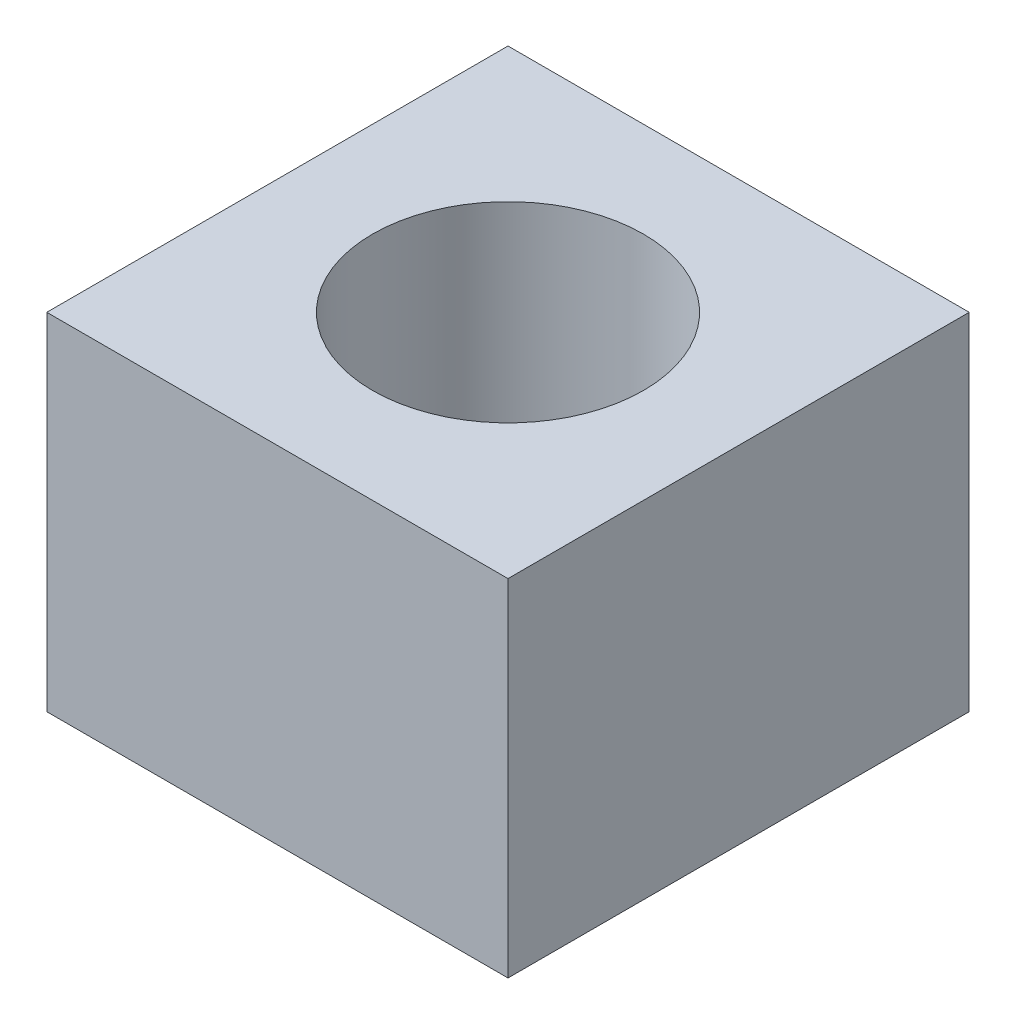
ISO-10303-21;
HEADER;
FILE_DESCRIPTION(('STEP AP214'),'2;1');
FILE_NAME('part.step','',(''),(''),'','','');
FILE_SCHEMA(('AUTOMOTIVE_DESIGN { 1 0 10303 214 1 1 1 1 }'));
ENDSEC;
DATA;
#1=APPLICATION_CONTEXT('core data for automotive mechanical design processes');
#2=APPLICATION_PROTOCOL_DEFINITION('international standard','automotive_design',2000,#1);
#3=PRODUCT_CONTEXT('',#1,'mechanical');
#4=PRODUCT('Part','Part','',(#3));
#5=PRODUCT_RELATED_PRODUCT_CATEGORY('part','',(#4));
#6=PRODUCT_DEFINITION_FORMATION('','',#4);
#7=PRODUCT_DEFINITION_CONTEXT('part definition',#1,'design');
#8=PRODUCT_DEFINITION('design','',#6,#7);
#9=PRODUCT_DEFINITION_SHAPE('','',#8);
#10=(LENGTH_UNIT() NAMED_UNIT(*) SI_UNIT(.MILLI.,.METRE.));
#11=(NAMED_UNIT(*) PLANE_ANGLE_UNIT() SI_UNIT($,.RADIAN.));
#12=(NAMED_UNIT(*) SI_UNIT($,.STERADIAN.) SOLID_ANGLE_UNIT());
#13=UNCERTAINTY_MEASURE_WITH_UNIT(LENGTH_MEASURE(1.E-05),#10,'distance_accuracy_value','');
#14=(GEOMETRIC_REPRESENTATION_CONTEXT(3) GLOBAL_UNCERTAINTY_ASSIGNED_CONTEXT((#13)) GLOBAL_UNIT_ASSIGNED_CONTEXT((#10,
#11,#12)) REPRESENTATION_CONTEXT('',''));
#15=CARTESIAN_POINT('',(0.,0.,0.));
#16=DIRECTION('',(0.,0.,1.));
#17=DIRECTION('',(1.,0.,0.));
#18=AXIS2_PLACEMENT_3D('',#15,#16,#17);
#19=CARTESIAN_POINT('',(40.,60.,40.));
#20=DIRECTION('',(-1.,0.,0.));
#21=DIRECTION('',(0.,0.,1.));
#22=AXIS2_PLACEMENT_3D('',#19,#20,#21);
#23=PLANE('',#22);
#24=DIRECTION('',(0.,0.,-1.));
#25=VECTOR('',#24,1.);
#26=CARTESIAN_POINT('',(40.,0.,40.));
#27=LINE('',#26,#25);
#28=CARTESIAN_POINT('',(40.,0.,40.));
#29=VERTEX_POINT('',#28);
#30=CARTESIAN_POINT('',(40.,0.,-40.));
#31=VERTEX_POINT('',#30);
#32=EDGE_CURVE('E105',#29,#31,#27,.T.);
#33=ORIENTED_EDGE('',*,*,#32,.T.);
#34=DIRECTION('',(0.,-1.,0.));
#35=VECTOR('',#34,1.);
#36=CARTESIAN_POINT('',(40.,60.,-40.));
#37=LINE('',#36,#35);
#38=CARTESIAN_POINT('',(40.,60.,-40.));
#39=VERTEX_POINT('',#38);
#40=EDGE_CURVE('E11',#39,#31,#37,.T.);
#41=ORIENTED_EDGE('',*,*,#40,.F.);
#42=DIRECTION('',(0.,0.,-1.));
#43=VECTOR('',#42,1.);
#44=CARTESIAN_POINT('',(40.,60.,40.));
#45=LINE('',#44,#43);
#46=CARTESIAN_POINT('',(40.,60.,40.));
#47=VERTEX_POINT('',#46);
#48=EDGE_CURVE('E89',#47,#39,#45,.T.);
#49=ORIENTED_EDGE('',*,*,#48,.F.);
#50=DIRECTION('',(0.,-1.,0.));
#51=VECTOR('',#50,1.);
#52=CARTESIAN_POINT('',(40.,60.,40.));
#53=LINE('',#52,#51);
#54=EDGE_CURVE('E97',#47,#29,#53,.T.);
#55=ORIENTED_EDGE('',*,*,#54,.T.);
#56=EDGE_LOOP('',(#33,#41,#49,#55));
#57=FACE_BOUND('',#56,.T.);
#58=ADVANCED_FACE('F39',(#57),#23,.F.);
#59=CARTESIAN_POINT('',(-40.,60.,-40.));
#60=DIRECTION('',(0.,0.,1.));
#61=DIRECTION('',(1.,0.,0.));
#62=AXIS2_PLACEMENT_3D('',#59,#60,#61);
#63=PLANE('',#62);
#64=DIRECTION('',(-1.,0.,0.));
#65=VECTOR('',#64,1.);
#66=CARTESIAN_POINT('',(-40.,0.,-40.));
#67=LINE('',#66,#65);
#68=CARTESIAN_POINT('',(-40.,0.,-40.));
#69=VERTEX_POINT('',#68);
#70=EDGE_CURVE('E92',#31,#69,#67,.T.);
#71=ORIENTED_EDGE('',*,*,#70,.T.);
#72=DIRECTION('',(0.,-1.,0.));
#73=VECTOR('',#72,1.);
#74=CARTESIAN_POINT('',(-40.,60.,-40.));
#75=LINE('',#74,#73);
#76=CARTESIAN_POINT('',(-40.,60.,-40.));
#77=VERTEX_POINT('',#76);
#78=EDGE_CURVE('E50',#77,#69,#75,.T.);
#79=ORIENTED_EDGE('',*,*,#78,.F.);
#80=DIRECTION('',(-1.,0.,0.));
#81=VECTOR('',#80,1.);
#82=CARTESIAN_POINT('',(-40.,60.,-40.));
#83=LINE('',#82,#81);
#84=EDGE_CURVE('E82',#39,#77,#83,.T.);
#85=ORIENTED_EDGE('',*,*,#84,.F.);
#86=ORIENTED_EDGE('',*,*,#40,.T.);
#87=EDGE_LOOP('',(#71,#79,#85,#86));
#88=FACE_BOUND('',#87,.T.);
#89=ADVANCED_FACE('F93',(#88),#63,.F.);
#90=CARTESIAN_POINT('',(-40.,60.,40.));
#91=DIRECTION('',(1.,0.,0.));
#92=DIRECTION('',(0.,0.,-1.));
#93=AXIS2_PLACEMENT_3D('',#90,#91,#92);
#94=PLANE('',#93);
#95=DIRECTION('',(0.,0.,1.));
#96=VECTOR('',#95,1.);
#97=CARTESIAN_POINT('',(-40.,0.,40.));
#98=LINE('',#97,#96);
#99=CARTESIAN_POINT('',(-40.,0.,40.));
#100=VERTEX_POINT('',#99);
#101=EDGE_CURVE('E75',#69,#100,#98,.T.);
#102=ORIENTED_EDGE('',*,*,#101,.T.);
#103=DIRECTION('',(0.,-1.,0.));
#104=VECTOR('',#103,1.);
#105=CARTESIAN_POINT('',(-40.,60.,40.));
#106=LINE('',#105,#104);
#107=CARTESIAN_POINT('',(-40.,60.,40.));
#108=VERTEX_POINT('',#107);
#109=EDGE_CURVE('E94',#108,#100,#106,.T.);
#110=ORIENTED_EDGE('',*,*,#109,.F.);
#111=DIRECTION('',(0.,0.,1.));
#112=VECTOR('',#111,1.);
#113=CARTESIAN_POINT('',(-40.,60.,40.));
#114=LINE('',#113,#112);
#115=EDGE_CURVE('E88',#77,#108,#114,.T.);
#116=ORIENTED_EDGE('',*,*,#115,.F.);
#117=ORIENTED_EDGE('',*,*,#78,.T.);
#118=EDGE_LOOP('',(#102,#110,#116,#117));
#119=FACE_BOUND('',#118,.T.);
#120=ADVANCED_FACE('F96',(#119),#94,.F.);
#121=CARTESIAN_POINT('',(-40.,60.,40.));
#122=DIRECTION('',(0.,0.,-1.));
#123=DIRECTION('',(-1.,0.,0.));
#124=AXIS2_PLACEMENT_3D('',#121,#122,#123);
#125=PLANE('',#124);
#126=DIRECTION('',(1.,0.,0.));
#127=VECTOR('',#126,1.);
#128=CARTESIAN_POINT('',(-40.,0.,40.));
#129=LINE('',#128,#127);
#130=EDGE_CURVE('E76',#100,#29,#129,.T.);
#131=ORIENTED_EDGE('',*,*,#130,.T.);
#132=ORIENTED_EDGE('',*,*,#54,.F.);
#133=DIRECTION('',(1.,0.,0.));
#134=VECTOR('',#133,1.);
#135=CARTESIAN_POINT('',(-40.,60.,40.));
#136=LINE('',#135,#134);
#137=EDGE_CURVE('E54',#108,#47,#136,.T.);
#138=ORIENTED_EDGE('',*,*,#137,.F.);
#139=ORIENTED_EDGE('',*,*,#109,.T.);
#140=EDGE_LOOP('',(#131,#132,#138,#139));
#141=FACE_BOUND('',#140,.T.);
#142=ADVANCED_FACE('F109',(#141),#125,.F.);
#143=CARTESIAN_POINT('',(0.,60.,0.));
#144=DIRECTION('',(0.,-1.,0.));
#145=DIRECTION('',(0.,0.,-1.));
#146=AXIS2_PLACEMENT_3D('',#143,#144,#145);
#147=PLANE('',#146);
#148=CARTESIAN_POINT('',(0.,60.,0.));
#149=DIRECTION('',(0.,1.,0.));
#150=DIRECTION('',(0.,0.,1.));
#151=AXIS2_PLACEMENT_3D('',#148,#149,#150);
#152=CIRCLE('',#151,23.5);
#153=CARTESIAN_POINT('',(0.,60.,23.5));
#154=VERTEX_POINT('',#153);
#155=EDGE_CURVE('E118',#154,#154,#152,.T.);
#156=ORIENTED_EDGE('',*,*,#155,.F.);
#157=EDGE_LOOP('',(#156));
#158=FACE_BOUND('',#157,.T.);
#159=ORIENTED_EDGE('',*,*,#48,.T.);
#160=ORIENTED_EDGE('',*,*,#84,.T.);
#161=ORIENTED_EDGE('',*,*,#115,.T.);
#162=ORIENTED_EDGE('',*,*,#137,.T.);
#163=EDGE_LOOP('',(#159,#160,#161,#162));
#164=FACE_BOUND('',#163,.T.);
#165=ADVANCED_FACE('F86',(#158,#164),#147,.F.);
#166=CARTESIAN_POINT('',(0.,0.,0.));
#167=DIRECTION('',(0.,-1.,0.));
#168=DIRECTION('',(0.,0.,-1.));
#169=AXIS2_PLACEMENT_3D('',#166,#167,#168);
#170=PLANE('',#169);
#171=ORIENTED_EDGE('',*,*,#32,.F.);
#172=ORIENTED_EDGE('',*,*,#130,.F.);
#173=ORIENTED_EDGE('',*,*,#101,.F.);
#174=ORIENTED_EDGE('',*,*,#70,.F.);
#175=EDGE_LOOP('',(#171,#172,#173,#174));
#176=FACE_BOUND('',#175,.T.);
#177=ADVANCED_FACE('F111',(#176),#170,.T.);
#178=CARTESIAN_POINT('',(0.,15.8,0.));
#179=DIRECTION('',(0.,1.,0.));
#180=DIRECTION('',(0.,0.,1.));
#181=AXIS2_PLACEMENT_3D('',#178,#179,#180);
#182=CYLINDRICAL_SURFACE('',#181,23.5);
#183=CARTESIAN_POINT('',(0.,15.8,0.));
#184=DIRECTION('',(0.,1.,0.));
#185=DIRECTION('',(0.,0.,1.));
#186=AXIS2_PLACEMENT_3D('',#183,#184,#185);
#187=CIRCLE('',#186,23.5);
#188=CARTESIAN_POINT('',(0.,15.8,23.5));
#189=VERTEX_POINT('',#188);
#190=EDGE_CURVE('E103',#189,#189,#187,.T.);
#191=ORIENTED_EDGE('',*,*,#190,.F.);
#192=EDGE_LOOP('',(#191));
#193=FACE_BOUND('',#192,.T.);
#194=ORIENTED_EDGE('',*,*,#155,.T.);
#195=EDGE_LOOP('',(#194));
#196=FACE_BOUND('',#195,.T.);
#197=ADVANCED_FACE('F125',(#193,#196),#182,.F.);
#198=CARTESIAN_POINT('',(0.,15.8,0.));
#199=DIRECTION('',(0.,1.,0.));
#200=DIRECTION('',(0.,0.,1.));
#201=AXIS2_PLACEMENT_3D('',#198,#199,#200);
#202=PLANE('',#201);
#203=ORIENTED_EDGE('',*,*,#190,.T.);
#204=EDGE_LOOP('',(#203));
#205=FACE_BOUND('',#204,.T.);
#206=ADVANCED_FACE('F122',(#205),#202,.T.);
#207=CLOSED_SHELL('',(#58,#89,#120,#142,#165,#177,#197,#206));
#208=MANIFOLD_SOLID_BREP('B2',#207);
#209=ADVANCED_BREP_SHAPE_REPRESENTATION('',(#18,#208),#14);
#210=SHAPE_DEFINITION_REPRESENTATION(#9,#209);
ENDSEC;
END-ISO-10303-21;
